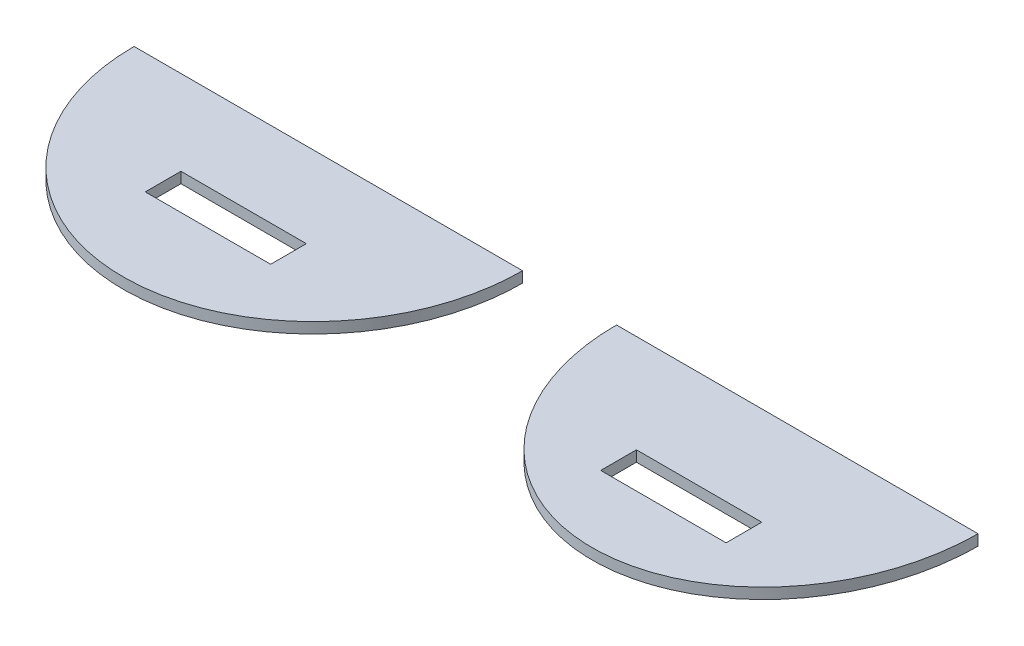
ISO-10303-21;
HEADER;
FILE_DESCRIPTION(('STEP AP214'),'2;1');
FILE_NAME('part.step','',(''),(''),'','','');
FILE_SCHEMA(('AUTOMOTIVE_DESIGN { 1 0 10303 214 1 1 1 1 }'));
ENDSEC;
DATA;
#1=APPLICATION_CONTEXT('core data for automotive mechanical design processes');
#2=APPLICATION_PROTOCOL_DEFINITION('international standard','automotive_design',2000,#1);
#3=PRODUCT_CONTEXT('',#1,'mechanical');
#4=PRODUCT('Part','Part','',(#3));
#5=PRODUCT_RELATED_PRODUCT_CATEGORY('part','',(#4));
#6=PRODUCT_DEFINITION_FORMATION('','',#4);
#7=PRODUCT_DEFINITION_CONTEXT('part definition',#1,'design');
#8=PRODUCT_DEFINITION('design','',#6,#7);
#9=PRODUCT_DEFINITION_SHAPE('','',#8);
#10=(LENGTH_UNIT() NAMED_UNIT(*) SI_UNIT(.MILLI.,.METRE.));
#11=(NAMED_UNIT(*) PLANE_ANGLE_UNIT() SI_UNIT($,.RADIAN.));
#12=(NAMED_UNIT(*) SI_UNIT($,.STERADIAN.) SOLID_ANGLE_UNIT());
#13=UNCERTAINTY_MEASURE_WITH_UNIT(LENGTH_MEASURE(1.E-05),#10,'distance_accuracy_value','');
#14=(GEOMETRIC_REPRESENTATION_CONTEXT(3) GLOBAL_UNCERTAINTY_ASSIGNED_CONTEXT((#13)) GLOBAL_UNIT_ASSIGNED_CONTEXT((#10,
#11,#12)) REPRESENTATION_CONTEXT('',''));
#15=CARTESIAN_POINT('',(0.,0.,0.));
#16=DIRECTION('',(0.,0.,1.));
#17=DIRECTION('',(1.,0.,0.));
#18=AXIS2_PLACEMENT_3D('',#15,#16,#17);
#19=CARTESIAN_POINT('',(6.96379661691276,2.54,-135.015597237982));
#20=DIRECTION('',(0.,1.,0.));
#21=DIRECTION('',(0.,0.,1.));
#22=AXIS2_PLACEMENT_3D('',#19,#20,#21);
#23=PLANE('',#22);
#24=CARTESIAN_POINT('',(6.96379661691276,2.54,-135.015597237982));
#25=DIRECTION('',(0.,1.,0.));
#26=DIRECTION('',(0.,0.,-1.));
#27=AXIS2_PLACEMENT_3D('',#24,#25,#26);
#28=ELLIPSE('',#27,48.26,42.545);
#29=CARTESIAN_POINT('',(-35.5812033830872,2.54,-135.015597237982));
#30=VERTEX_POINT('',#29);
#31=CARTESIAN_POINT('',(49.5087966169128,2.54,-135.015597237982));
#32=VERTEX_POINT('',#31);
#33=EDGE_CURVE('E132',#30,#32,#28,.T.);
#34=ORIENTED_EDGE('',*,*,#33,.T.);
#35=DIRECTION('',(-1.,0.,0.));
#36=VECTOR('',#35,1.);
#37=CARTESIAN_POINT('',(49.5087966169128,2.54,-135.015597237982));
#38=LINE('',#37,#36);
#39=EDGE_CURVE('E136',#32,#30,#38,.T.);
#40=ORIENTED_EDGE('',*,*,#39,.T.);
#41=EDGE_LOOP('',(#34,#40));
#42=FACE_BOUND('',#41,.T.);
#43=DIRECTION('',(0.,0.,1.));
#44=VECTOR('',#43,1.);
#45=CARTESIAN_POINT('',(-7.79360338308724,2.54,-111.914297237982));
#46=LINE('',#45,#44);
#47=CARTESIAN_POINT('',(-7.79360338308724,2.54,-111.914297237982));
#48=VERTEX_POINT('',#47);
#49=CARTESIAN_POINT('',(-7.79360338308724,2.54,-103.506897237982));
#50=VERTEX_POINT('',#49);
#51=EDGE_CURVE('E105',#48,#50,#46,.T.);
#52=ORIENTED_EDGE('',*,*,#51,.F.);
#53=DIRECTION('',(-1.,0.,0.));
#54=VECTOR('',#53,1.);
#55=CARTESIAN_POINT('',(-7.79360338308724,2.54,-111.914297237982));
#56=LINE('',#55,#54);
#57=CARTESIAN_POINT('',(21.7211966169128,2.54,-111.914297237982));
#58=VERTEX_POINT('',#57);
#59=EDGE_CURVE('E97',#58,#48,#56,.T.);
#60=ORIENTED_EDGE('',*,*,#59,.F.);
#61=DIRECTION('',(0.,0.,-1.));
#62=VECTOR('',#61,1.);
#63=CARTESIAN_POINT('',(21.7211966169128,2.54,-111.914297237982));
#64=LINE('',#63,#62);
#65=CARTESIAN_POINT('',(21.7211966169128,2.54,-103.506897237982));
#66=VERTEX_POINT('',#65);
#67=EDGE_CURVE('E119',#66,#58,#64,.T.);
#68=ORIENTED_EDGE('',*,*,#67,.F.);
#69=DIRECTION('',(1.,0.,0.));
#70=VECTOR('',#69,1.);
#71=CARTESIAN_POINT('',(21.7211966169128,2.54,-103.506897237982));
#72=LINE('',#71,#70);
#73=EDGE_CURVE('E117',#50,#66,#72,.T.);
#74=ORIENTED_EDGE('',*,*,#73,.F.);
#75=EDGE_LOOP('',(#52,#60,#68,#74));
#76=FACE_BOUND('',#75,.T.);
#77=ADVANCED_FACE('F43',(#42,#76),#23,.T.);
#78=CARTESIAN_POINT('',(6.96379661691276,0.,-135.015597237982));
#79=DIRECTION('',(0.,1.,0.));
#80=DIRECTION('',(0.,0.,1.));
#81=AXIS2_PLACEMENT_3D('',#78,#79,#80);
#82=PLANE('',#81);
#83=CARTESIAN_POINT('',(6.96379661691276,0.,-135.015597237982));
#84=DIRECTION('',(0.,1.,0.));
#85=DIRECTION('',(0.,0.,-1.));
#86=AXIS2_PLACEMENT_3D('',#83,#84,#85);
#87=ELLIPSE('',#86,48.26,42.545);
#88=CARTESIAN_POINT('',(-35.5812033830872,0.,-135.015597237982));
#89=VERTEX_POINT('',#88);
#90=CARTESIAN_POINT('',(49.5087966169128,0.,-135.015597237982));
#91=VERTEX_POINT('',#90);
#92=EDGE_CURVE('E113',#89,#91,#87,.T.);
#93=ORIENTED_EDGE('',*,*,#92,.F.);
#94=DIRECTION('',(-1.,0.,0.));
#95=VECTOR('',#94,1.);
#96=CARTESIAN_POINT('',(49.5087966169128,0.,-135.015597237982));
#97=LINE('',#96,#95);
#98=EDGE_CURVE('E137',#91,#89,#97,.T.);
#99=ORIENTED_EDGE('',*,*,#98,.F.);
#100=EDGE_LOOP('',(#93,#99));
#101=FACE_BOUND('',#100,.T.);
#102=DIRECTION('',(-1.,0.,0.));
#103=VECTOR('',#102,1.);
#104=CARTESIAN_POINT('',(-7.79360338308724,0.,-111.914297237982));
#105=LINE('',#104,#103);
#106=CARTESIAN_POINT('',(21.7211966169128,0.,-111.914297237982));
#107=VERTEX_POINT('',#106);
#108=CARTESIAN_POINT('',(-7.79360338308724,0.,-111.914297237982));
#109=VERTEX_POINT('',#108);
#110=EDGE_CURVE('E67',#107,#109,#105,.T.);
#111=ORIENTED_EDGE('',*,*,#110,.T.);
#112=DIRECTION('',(0.,0.,1.));
#113=VECTOR('',#112,1.);
#114=CARTESIAN_POINT('',(-7.79360338308724,0.,-111.914297237982));
#115=LINE('',#114,#113);
#116=CARTESIAN_POINT('',(-7.79360338308724,0.,-103.506897237982));
#117=VERTEX_POINT('',#116);
#118=EDGE_CURVE('E112',#109,#117,#115,.T.);
#119=ORIENTED_EDGE('',*,*,#118,.T.);
#120=DIRECTION('',(1.,0.,0.));
#121=VECTOR('',#120,1.);
#122=CARTESIAN_POINT('',(21.7211966169128,0.,-103.506897237982));
#123=LINE('',#122,#121);
#124=CARTESIAN_POINT('',(21.7211966169128,0.,-103.506897237982));
#125=VERTEX_POINT('',#124);
#126=EDGE_CURVE('E125',#117,#125,#123,.T.);
#127=ORIENTED_EDGE('',*,*,#126,.T.);
#128=DIRECTION('',(0.,0.,-1.));
#129=VECTOR('',#128,1.);
#130=CARTESIAN_POINT('',(21.7211966169128,0.,-111.914297237982));
#131=LINE('',#130,#129);
#132=EDGE_CURVE('E106',#125,#107,#131,.T.);
#133=ORIENTED_EDGE('',*,*,#132,.T.);
#134=EDGE_LOOP('',(#111,#119,#127,#133));
#135=FACE_BOUND('',#134,.T.);
#136=ADVANCED_FACE('F149',(#101,#135),#82,.F.);
#137=DIRECTION('',(0.,-1.,0.));
#138=VECTOR('',#137,1.);
#139=SURFACE_OF_LINEAR_EXTRUSION('',#28,#138);
#140=ORIENTED_EDGE('',*,*,#92,.T.);
#141=DIRECTION('',(0.,-1.,0.));
#142=VECTOR('',#141,1.);
#143=CARTESIAN_POINT('',(49.5087966169128,2.54,-135.015597237982));
#144=LINE('',#143,#142);
#145=EDGE_CURVE('E12',#32,#91,#144,.T.);
#146=ORIENTED_EDGE('',*,*,#145,.F.);
#147=ORIENTED_EDGE('',*,*,#33,.F.);
#148=DIRECTION('',(0.,-1.,0.));
#149=VECTOR('',#148,1.);
#150=CARTESIAN_POINT('',(-35.5812033830872,2.54,-135.015597237982));
#151=LINE('',#150,#149);
#152=EDGE_CURVE('E52',#30,#89,#151,.T.);
#153=ORIENTED_EDGE('',*,*,#152,.T.);
#154=EDGE_LOOP('',(#140,#146,#147,#153));
#155=FACE_BOUND('',#154,.T.);
#156=ADVANCED_FACE('F45',(#155),#139,.F.);
#157=CARTESIAN_POINT('',(49.5087966169128,2.54,-135.015597237982));
#158=DIRECTION('',(0.,0.,1.));
#159=DIRECTION('',(1.,0.,0.));
#160=AXIS2_PLACEMENT_3D('',#157,#158,#159);
#161=PLANE('',#160);
#162=ORIENTED_EDGE('',*,*,#98,.T.);
#163=ORIENTED_EDGE('',*,*,#152,.F.);
#164=ORIENTED_EDGE('',*,*,#39,.F.);
#165=ORIENTED_EDGE('',*,*,#145,.T.);
#166=EDGE_LOOP('',(#162,#163,#164,#165));
#167=FACE_BOUND('',#166,.T.);
#168=ADVANCED_FACE('F151',(#167),#161,.F.);
#169=CARTESIAN_POINT('',(-7.79360338308724,2.54,-111.914297237982));
#170=DIRECTION('',(0.,0.,1.));
#171=DIRECTION('',(1.,0.,0.));
#172=AXIS2_PLACEMENT_3D('',#169,#170,#171);
#173=PLANE('',#172);
#174=ORIENTED_EDGE('',*,*,#110,.F.);
#175=DIRECTION('',(0.,-1.,0.));
#176=VECTOR('',#175,1.);
#177=CARTESIAN_POINT('',(21.7211966169128,2.54,-111.914297237982));
#178=LINE('',#177,#176);
#179=EDGE_CURVE('E101',#58,#107,#178,.T.);
#180=ORIENTED_EDGE('',*,*,#179,.F.);
#181=ORIENTED_EDGE('',*,*,#59,.T.);
#182=DIRECTION('',(0.,-1.,0.));
#183=VECTOR('',#182,1.);
#184=CARTESIAN_POINT('',(-7.79360338308724,2.54,-111.914297237982));
#185=LINE('',#184,#183);
#186=EDGE_CURVE('E100',#48,#109,#185,.T.);
#187=ORIENTED_EDGE('',*,*,#186,.T.);
#188=EDGE_LOOP('',(#174,#180,#181,#187));
#189=FACE_BOUND('',#188,.T.);
#190=ADVANCED_FACE('F99',(#189),#173,.T.);
#191=CARTESIAN_POINT('',(-7.79360338308724,2.54,-111.914297237982));
#192=DIRECTION('',(1.,0.,0.));
#193=DIRECTION('',(0.,0.,-1.));
#194=AXIS2_PLACEMENT_3D('',#191,#192,#193);
#195=PLANE('',#194);
#196=ORIENTED_EDGE('',*,*,#118,.F.);
#197=ORIENTED_EDGE('',*,*,#186,.F.);
#198=ORIENTED_EDGE('',*,*,#51,.T.);
#199=DIRECTION('',(0.,-1.,0.));
#200=VECTOR('',#199,1.);
#201=CARTESIAN_POINT('',(-7.79360338308724,2.54,-103.506897237982));
#202=LINE('',#201,#200);
#203=EDGE_CURVE('E114',#50,#117,#202,.T.);
#204=ORIENTED_EDGE('',*,*,#203,.T.);
#205=EDGE_LOOP('',(#196,#197,#198,#204));
#206=FACE_BOUND('',#205,.T.);
#207=ADVANCED_FACE('F109',(#206),#195,.T.);
#208=CARTESIAN_POINT('',(21.7211966169128,2.54,-103.506897237982));
#209=DIRECTION('',(0.,0.,-1.));
#210=DIRECTION('',(-1.,0.,0.));
#211=AXIS2_PLACEMENT_3D('',#208,#209,#210);
#212=PLANE('',#211);
#213=ORIENTED_EDGE('',*,*,#126,.F.);
#214=ORIENTED_EDGE('',*,*,#203,.F.);
#215=ORIENTED_EDGE('',*,*,#73,.T.);
#216=DIRECTION('',(0.,-1.,0.));
#217=VECTOR('',#216,1.);
#218=CARTESIAN_POINT('',(21.7211966169128,2.54,-103.506897237982));
#219=LINE('',#218,#217);
#220=EDGE_CURVE('E59',#66,#125,#219,.T.);
#221=ORIENTED_EDGE('',*,*,#220,.T.);
#222=EDGE_LOOP('',(#213,#214,#215,#221));
#223=FACE_BOUND('',#222,.T.);
#224=ADVANCED_FACE('F197',(#223),#212,.T.);
#225=CARTESIAN_POINT('',(21.7211966169128,2.54,-111.914297237982));
#226=DIRECTION('',(-1.,0.,0.));
#227=DIRECTION('',(0.,0.,1.));
#228=AXIS2_PLACEMENT_3D('',#225,#226,#227);
#229=PLANE('',#228);
#230=ORIENTED_EDGE('',*,*,#132,.F.);
#231=ORIENTED_EDGE('',*,*,#220,.F.);
#232=ORIENTED_EDGE('',*,*,#67,.T.);
#233=ORIENTED_EDGE('',*,*,#179,.T.);
#234=EDGE_LOOP('',(#230,#231,#232,#233));
#235=FACE_BOUND('',#234,.T.);
#236=ADVANCED_FACE('F204',(#235),#229,.T.);
#237=CLOSED_SHELL('',(#77,#136,#156,#168,#190,#207,#224,#236));
#238=MANIFOLD_SOLID_BREP('B2',#237);
#239=CARTESIAN_POINT('',(-103.421343613317,2.54,-135.015597237982));
#240=DIRECTION('',(0.,1.,0.));
#241=DIRECTION('',(0.,0.,1.));
#242=AXIS2_PLACEMENT_3D('',#239,#240,#241);
#243=PLANE('',#242);
#244=CARTESIAN_POINT('',(-103.421343613317,2.54,-135.015597237982));
#245=DIRECTION('',(0.,1.,0.));
#246=DIRECTION('',(0.,0.,-1.));
#247=AXIS2_PLACEMENT_3D('',#244,#245,#246);
#248=ELLIPSE('',#247,48.26,45.7199999999998);
#249=CARTESIAN_POINT('',(-149.141343613317,2.54,-135.015597237982));
#250=VERTEX_POINT('',#249);
#251=CARTESIAN_POINT('',(-57.701343613317,2.54,-135.015597237982));
#252=VERTEX_POINT('',#251);
#253=EDGE_CURVE('E311',#250,#252,#248,.T.);
#254=ORIENTED_EDGE('',*,*,#253,.T.);
#255=DIRECTION('',(-1.,0.,0.));
#256=VECTOR('',#255,1.);
#257=CARTESIAN_POINT('',(-149.141343613317,2.54,-135.015597237982));
#258=LINE('',#257,#256);
#259=EDGE_CURVE('E315',#252,#250,#258,.T.);
#260=ORIENTED_EDGE('',*,*,#259,.T.);
#261=EDGE_LOOP('',(#254,#260));
#262=FACE_BOUND('',#261,.T.);
#263=DIRECTION('',(0.,0.,1.));
#264=VECTOR('',#263,1.);
#265=CARTESIAN_POINT('',(-118.178743613317,2.54,-115.089297237982));
#266=LINE('',#265,#264);
#267=CARTESIAN_POINT('',(-118.178743613317,2.54,-115.089297237982));
#268=VERTEX_POINT('',#267);
#269=CARTESIAN_POINT('',(-118.178743613317,2.54,-106.681897237982));
#270=VERTEX_POINT('',#269);
#271=EDGE_CURVE('E284',#268,#270,#266,.T.);
#272=ORIENTED_EDGE('',*,*,#271,.F.);
#273=DIRECTION('',(-1.,0.,0.));
#274=VECTOR('',#273,1.);
#275=CARTESIAN_POINT('',(-118.178743613317,2.54,-115.089297237982));
#276=LINE('',#275,#274);
#277=CARTESIAN_POINT('',(-88.6639436133167,2.54,-115.089297237982));
#278=VERTEX_POINT('',#277);
#279=EDGE_CURVE('E276',#278,#268,#276,.T.);
#280=ORIENTED_EDGE('',*,*,#279,.F.);
#281=DIRECTION('',(0.,0.,-1.));
#282=VECTOR('',#281,1.);
#283=CARTESIAN_POINT('',(-88.6639436133167,2.54,-115.089297237982));
#284=LINE('',#283,#282);
#285=CARTESIAN_POINT('',(-88.6639436133167,2.54,-106.681897237982));
#286=VERTEX_POINT('',#285);
#287=EDGE_CURVE('E298',#286,#278,#284,.T.);
#288=ORIENTED_EDGE('',*,*,#287,.F.);
#289=DIRECTION('',(1.,0.,0.));
#290=VECTOR('',#289,1.);
#291=CARTESIAN_POINT('',(-88.6639436133167,2.54,-106.681897237982));
#292=LINE('',#291,#290);
#293=EDGE_CURVE('E296',#270,#286,#292,.T.);
#294=ORIENTED_EDGE('',*,*,#293,.F.);
#295=EDGE_LOOP('',(#272,#280,#288,#294));
#296=FACE_BOUND('',#295,.T.);
#297=ADVANCED_FACE('F222',(#262,#296),#243,.T.);
#298=CARTESIAN_POINT('',(-103.421343613317,0.,-135.015597237982));
#299=DIRECTION('',(0.,1.,0.));
#300=DIRECTION('',(0.,0.,1.));
#301=AXIS2_PLACEMENT_3D('',#298,#299,#300);
#302=PLANE('',#301);
#303=CARTESIAN_POINT('',(-103.421343613317,0.,-135.015597237982));
#304=DIRECTION('',(0.,1.,0.));
#305=DIRECTION('',(0.,0.,-1.));
#306=AXIS2_PLACEMENT_3D('',#303,#304,#305);
#307=ELLIPSE('',#306,48.26,45.7199999999998);
#308=CARTESIAN_POINT('',(-149.141343613317,0.,-135.015597237982));
#309=VERTEX_POINT('',#308);
#310=CARTESIAN_POINT('',(-57.701343613317,0.,-135.015597237982));
#311=VERTEX_POINT('',#310);
#312=EDGE_CURVE('E292',#309,#311,#307,.T.);
#313=ORIENTED_EDGE('',*,*,#312,.F.);
#314=DIRECTION('',(-1.,0.,0.));
#315=VECTOR('',#314,1.);
#316=CARTESIAN_POINT('',(-149.141343613317,0.,-135.015597237982));
#317=LINE('',#316,#315);
#318=EDGE_CURVE('E316',#311,#309,#317,.T.);
#319=ORIENTED_EDGE('',*,*,#318,.F.);
#320=EDGE_LOOP('',(#313,#319));
#321=FACE_BOUND('',#320,.T.);
#322=DIRECTION('',(-1.,0.,0.));
#323=VECTOR('',#322,1.);
#324=CARTESIAN_POINT('',(-118.178743613317,0.,-115.089297237982));
#325=LINE('',#324,#323);
#326=CARTESIAN_POINT('',(-88.6639436133167,0.,-115.089297237982));
#327=VERTEX_POINT('',#326);
#328=CARTESIAN_POINT('',(-118.178743613317,0.,-115.089297237982));
#329=VERTEX_POINT('',#328);
#330=EDGE_CURVE('E246',#327,#329,#325,.T.);
#331=ORIENTED_EDGE('',*,*,#330,.T.);
#332=DIRECTION('',(0.,0.,1.));
#333=VECTOR('',#332,1.);
#334=CARTESIAN_POINT('',(-118.178743613317,0.,-115.089297237982));
#335=LINE('',#334,#333);
#336=CARTESIAN_POINT('',(-118.178743613317,0.,-106.681897237982));
#337=VERTEX_POINT('',#336);
#338=EDGE_CURVE('E291',#329,#337,#335,.T.);
#339=ORIENTED_EDGE('',*,*,#338,.T.);
#340=DIRECTION('',(1.,0.,0.));
#341=VECTOR('',#340,1.);
#342=CARTESIAN_POINT('',(-88.6639436133167,0.,-106.681897237982));
#343=LINE('',#342,#341);
#344=CARTESIAN_POINT('',(-88.6639436133167,0.,-106.681897237982));
#345=VERTEX_POINT('',#344);
#346=EDGE_CURVE('E304',#337,#345,#343,.T.);
#347=ORIENTED_EDGE('',*,*,#346,.T.);
#348=DIRECTION('',(0.,0.,-1.));
#349=VECTOR('',#348,1.);
#350=CARTESIAN_POINT('',(-88.6639436133167,0.,-115.089297237982));
#351=LINE('',#350,#349);
#352=EDGE_CURVE('E285',#345,#327,#351,.T.);
#353=ORIENTED_EDGE('',*,*,#352,.T.);
#354=EDGE_LOOP('',(#331,#339,#347,#353));
#355=FACE_BOUND('',#354,.T.);
#356=ADVANCED_FACE('F328',(#321,#355),#302,.F.);
#357=DIRECTION('',(0.,-1.,0.));
#358=VECTOR('',#357,1.);
#359=SURFACE_OF_LINEAR_EXTRUSION('',#248,#358);
#360=ORIENTED_EDGE('',*,*,#312,.T.);
#361=DIRECTION('',(0.,-1.,0.));
#362=VECTOR('',#361,1.);
#363=CARTESIAN_POINT('',(-57.701343613317,2.54,-135.015597237982));
#364=LINE('',#363,#362);
#365=EDGE_CURVE('E41',#252,#311,#364,.T.);
#366=ORIENTED_EDGE('',*,*,#365,.F.);
#367=ORIENTED_EDGE('',*,*,#253,.F.);
#368=DIRECTION('',(0.,-1.,0.));
#369=VECTOR('',#368,1.);
#370=CARTESIAN_POINT('',(-149.141343613317,2.54,-135.015597237982));
#371=LINE('',#370,#369);
#372=EDGE_CURVE('E231',#250,#309,#371,.T.);
#373=ORIENTED_EDGE('',*,*,#372,.T.);
#374=EDGE_LOOP('',(#360,#366,#367,#373));
#375=FACE_BOUND('',#374,.T.);
#376=ADVANCED_FACE('F224',(#375),#359,.F.);
#377=CARTESIAN_POINT('',(-149.141343613317,2.54,-135.015597237982));
#378=DIRECTION('',(0.,0.,1.));
#379=DIRECTION('',(1.,0.,0.));
#380=AXIS2_PLACEMENT_3D('',#377,#378,#379);
#381=PLANE('',#380);
#382=ORIENTED_EDGE('',*,*,#318,.T.);
#383=ORIENTED_EDGE('',*,*,#372,.F.);
#384=ORIENTED_EDGE('',*,*,#259,.F.);
#385=ORIENTED_EDGE('',*,*,#365,.T.);
#386=EDGE_LOOP('',(#382,#383,#384,#385));
#387=FACE_BOUND('',#386,.T.);
#388=ADVANCED_FACE('F330',(#387),#381,.F.);
#389=CARTESIAN_POINT('',(-118.178743613317,2.54,-115.089297237982));
#390=DIRECTION('',(0.,0.,1.));
#391=DIRECTION('',(1.,0.,0.));
#392=AXIS2_PLACEMENT_3D('',#389,#390,#391);
#393=PLANE('',#392);
#394=ORIENTED_EDGE('',*,*,#330,.F.);
#395=DIRECTION('',(0.,-1.,0.));
#396=VECTOR('',#395,1.);
#397=CARTESIAN_POINT('',(-88.6639436133167,2.54,-115.089297237982));
#398=LINE('',#397,#396);
#399=EDGE_CURVE('E280',#278,#327,#398,.T.);
#400=ORIENTED_EDGE('',*,*,#399,.F.);
#401=ORIENTED_EDGE('',*,*,#279,.T.);
#402=DIRECTION('',(0.,-1.,0.));
#403=VECTOR('',#402,1.);
#404=CARTESIAN_POINT('',(-118.178743613317,2.54,-115.089297237982));
#405=LINE('',#404,#403);
#406=EDGE_CURVE('E279',#268,#329,#405,.T.);
#407=ORIENTED_EDGE('',*,*,#406,.T.);
#408=EDGE_LOOP('',(#394,#400,#401,#407));
#409=FACE_BOUND('',#408,.T.);
#410=ADVANCED_FACE('F278',(#409),#393,.T.);
#411=CARTESIAN_POINT('',(-118.178743613317,2.54,-115.089297237982));
#412=DIRECTION('',(1.,0.,0.));
#413=DIRECTION('',(0.,0.,-1.));
#414=AXIS2_PLACEMENT_3D('',#411,#412,#413);
#415=PLANE('',#414);
#416=ORIENTED_EDGE('',*,*,#338,.F.);
#417=ORIENTED_EDGE('',*,*,#406,.F.);
#418=ORIENTED_EDGE('',*,*,#271,.T.);
#419=DIRECTION('',(0.,-1.,0.));
#420=VECTOR('',#419,1.);
#421=CARTESIAN_POINT('',(-118.178743613317,2.54,-106.681897237982));
#422=LINE('',#421,#420);
#423=EDGE_CURVE('E293',#270,#337,#422,.T.);
#424=ORIENTED_EDGE('',*,*,#423,.T.);
#425=EDGE_LOOP('',(#416,#417,#418,#424));
#426=FACE_BOUND('',#425,.T.);
#427=ADVANCED_FACE('F288',(#426),#415,.T.);
#428=CARTESIAN_POINT('',(-88.6639436133167,2.54,-106.681897237982));
#429=DIRECTION('',(0.,0.,-1.));
#430=DIRECTION('',(-1.,0.,0.));
#431=AXIS2_PLACEMENT_3D('',#428,#429,#430);
#432=PLANE('',#431);
#433=ORIENTED_EDGE('',*,*,#346,.F.);
#434=ORIENTED_EDGE('',*,*,#423,.F.);
#435=ORIENTED_EDGE('',*,*,#293,.T.);
#436=DIRECTION('',(0.,-1.,0.));
#437=VECTOR('',#436,1.);
#438=CARTESIAN_POINT('',(-88.6639436133167,2.54,-106.681897237982));
#439=LINE('',#438,#437);
#440=EDGE_CURVE('E238',#286,#345,#439,.T.);
#441=ORIENTED_EDGE('',*,*,#440,.T.);
#442=EDGE_LOOP('',(#433,#434,#435,#441));
#443=FACE_BOUND('',#442,.T.);
#444=ADVANCED_FACE('F376',(#443),#432,.T.);
#445=CARTESIAN_POINT('',(-88.6639436133167,2.54,-115.089297237982));
#446=DIRECTION('',(-1.,0.,0.));
#447=DIRECTION('',(0.,0.,1.));
#448=AXIS2_PLACEMENT_3D('',#445,#446,#447);
#449=PLANE('',#448);
#450=ORIENTED_EDGE('',*,*,#352,.F.);
#451=ORIENTED_EDGE('',*,*,#440,.F.);
#452=ORIENTED_EDGE('',*,*,#287,.T.);
#453=ORIENTED_EDGE('',*,*,#399,.T.);
#454=EDGE_LOOP('',(#450,#451,#452,#453));
#455=FACE_BOUND('',#454,.T.);
#456=ADVANCED_FACE('F383',(#455),#449,.T.);
#457=CLOSED_SHELL('',(#297,#356,#376,#388,#410,#427,#444,#456));
#458=MANIFOLD_SOLID_BREP('B6',#457);
#459=ADVANCED_BREP_SHAPE_REPRESENTATION('',(#18,#238,#458),#14);
#460=SHAPE_DEFINITION_REPRESENTATION(#9,#459);
ENDSEC;
END-ISO-10303-21;
